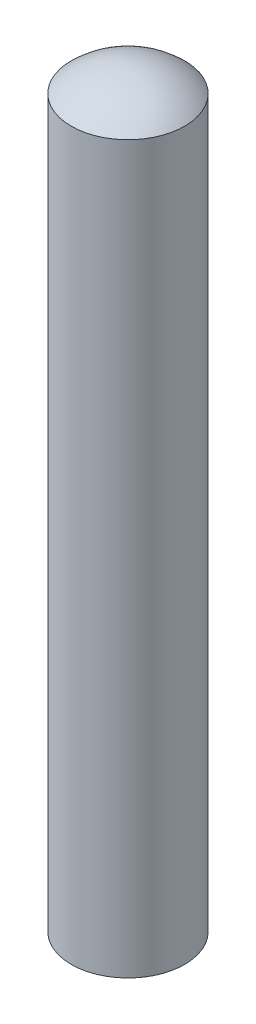
ISO-10303-21;
HEADER;
FILE_DESCRIPTION(('STEP AP214'),'2;1');
FILE_NAME('part.step','',(''),(''),'','','');
FILE_SCHEMA(('AUTOMOTIVE_DESIGN { 1 0 10303 214 1 1 1 1 }'));
ENDSEC;
DATA;
#1=APPLICATION_CONTEXT('core data for automotive mechanical design processes');
#2=APPLICATION_PROTOCOL_DEFINITION('international standard','automotive_design',2000,#1);
#3=PRODUCT_CONTEXT('',#1,'mechanical');
#4=PRODUCT('Part','Part','',(#3));
#5=PRODUCT_RELATED_PRODUCT_CATEGORY('part','',(#4));
#6=PRODUCT_DEFINITION_FORMATION('','',#4);
#7=PRODUCT_DEFINITION_CONTEXT('part definition',#1,'design');
#8=PRODUCT_DEFINITION('design','',#6,#7);
#9=PRODUCT_DEFINITION_SHAPE('','',#8);
#10=(LENGTH_UNIT() NAMED_UNIT(*) SI_UNIT(.MILLI.,.METRE.));
#11=(NAMED_UNIT(*) PLANE_ANGLE_UNIT() SI_UNIT($,.RADIAN.));
#12=(NAMED_UNIT(*) SI_UNIT($,.STERADIAN.) SOLID_ANGLE_UNIT());
#13=UNCERTAINTY_MEASURE_WITH_UNIT(LENGTH_MEASURE(1.E-05),#10,'distance_accuracy_value','');
#14=(GEOMETRIC_REPRESENTATION_CONTEXT(3) GLOBAL_UNCERTAINTY_ASSIGNED_CONTEXT((#13)) GLOBAL_UNIT_ASSIGNED_CONTEXT((#10,
#11,#12)) REPRESENTATION_CONTEXT('',''));
#15=CARTESIAN_POINT('',(0.,0.,0.));
#16=DIRECTION('',(0.,0.,1.));
#17=DIRECTION('',(1.,0.,0.));
#18=AXIS2_PLACEMENT_3D('',#15,#16,#17);
#19=CARTESIAN_POINT('',(0.,0.,0.));
#20=DIRECTION('',(0.,-1.,0.));
#21=DIRECTION('',(0.,0.,-1.));
#22=AXIS2_PLACEMENT_3D('',#19,#20,#21);
#23=PLANE('',#22);
#24=CARTESIAN_POINT('',(0.,0.,0.));
#25=DIRECTION('',(0.,1.,0.));
#26=DIRECTION('',(0.,0.,1.));
#27=AXIS2_PLACEMENT_3D('',#24,#25,#26);
#28=CIRCLE('',#27,12.5);
#29=CARTESIAN_POINT('',(0.,0.,12.5));
#30=VERTEX_POINT('',#29);
#31=EDGE_CURVE('E10',#30,#30,#28,.T.);
#32=ORIENTED_EDGE('',*,*,#31,.F.);
#33=EDGE_LOOP('',(#32));
#34=FACE_BOUND('',#33,.T.);
#35=ADVANCED_FACE('F38',(#34),#23,.T.);
#36=CARTESIAN_POINT('',(0.,160.,0.));
#37=DIRECTION('',(0.,1.,0.));
#38=DIRECTION('',(0.,0.,1.));
#39=AXIS2_PLACEMENT_3D('',#36,#37,#38);
#40=CYLINDRICAL_SURFACE('',#39,12.5);
#41=ORIENTED_EDGE('',*,*,#31,.T.);
#42=EDGE_LOOP('',(#41));
#43=FACE_BOUND('',#42,.T.);
#44=CARTESIAN_POINT('',(0.,160.,0.));
#45=DIRECTION('',(0.,1.,0.));
#46=DIRECTION('',(0.,0.,1.));
#47=AXIS2_PLACEMENT_3D('',#44,#45,#46);
#48=CIRCLE('',#47,12.5);
#49=CARTESIAN_POINT('',(0.,160.,12.5));
#50=VERTEX_POINT('',#49);
#51=EDGE_CURVE('E42',#50,#50,#48,.T.);
#52=ORIENTED_EDGE('',*,*,#51,.F.);
#53=EDGE_LOOP('',(#52));
#54=FACE_BOUND('',#53,.T.);
#55=ADVANCED_FACE('F52',(#43,#54),#40,.T.);
#56=CARTESIAN_POINT('',(0.,146.875,0.));
#57=DIRECTION('',(0.,0.,1.));
#58=DIRECTION('',(1.,0.,0.));
#59=AXIS2_PLACEMENT_3D('',#56,#57,#58);
#60=SPHERICAL_SURFACE('',#59,18.1249999999999);
#61=CARTESIAN_POINT('',(0.,146.875,0.));
#62=DIRECTION('',(0.,1.,0.));
#63=DIRECTION('',(0.,0.,1.));
#64=AXIS2_PLACEMENT_3D('',#61,#62,#63);
#65=SPHERICAL_SURFACE('',#64,18.1249999999999);
#66=ORIENTED_EDGE('',*,*,#51,.T.);
#67=EDGE_LOOP('',(#66));
#68=FACE_BOUND('',#67,.T.);
#69=ADVANCED_FACE('F40',(#68),#65,.T.);
#70=CLOSED_SHELL('',(#35,#55,#69));
#71=MANIFOLD_SOLID_BREP('B2',#70);
#72=ADVANCED_BREP_SHAPE_REPRESENTATION('',(#18,#71),#14);
#73=SHAPE_DEFINITION_REPRESENTATION(#9,#72);
ENDSEC;
END-ISO-10303-21;
